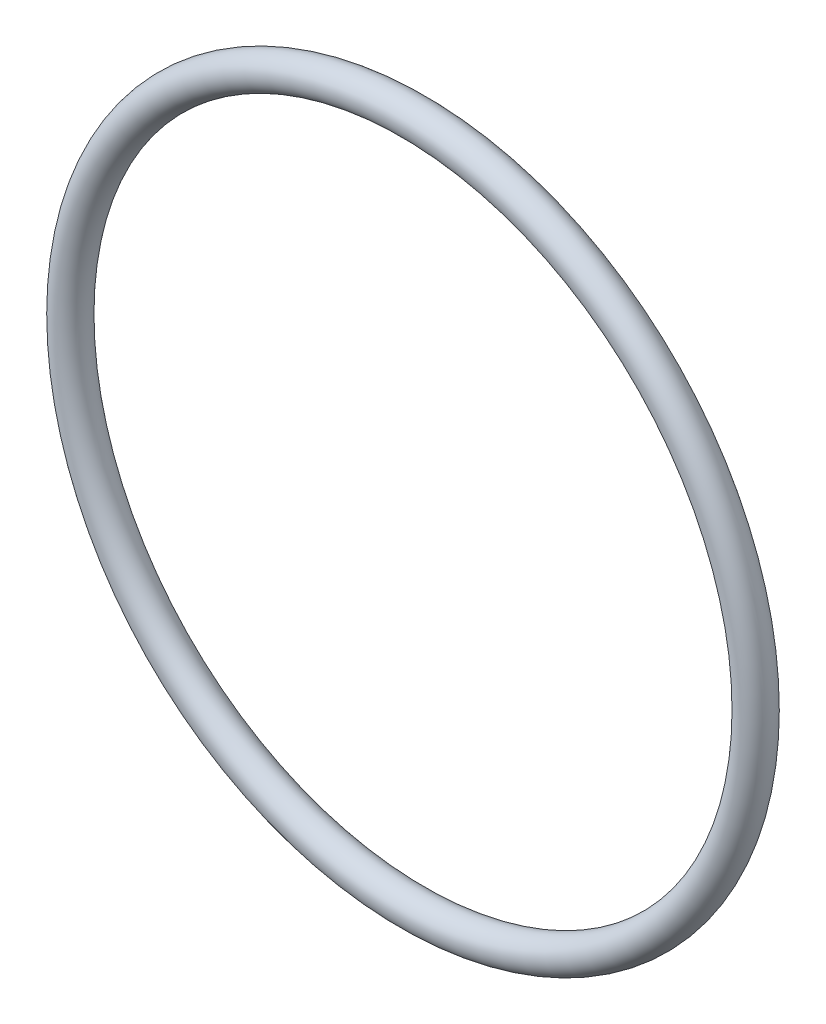
ISO-10303-21;
HEADER;
FILE_DESCRIPTION(('STEP AP214'),'2;1');
FILE_NAME('part.step','',(''),(''),'','','');
FILE_SCHEMA(('AUTOMOTIVE_DESIGN { 1 0 10303 214 1 1 1 1 }'));
ENDSEC;
DATA;
#1=APPLICATION_CONTEXT('core data for automotive mechanical design processes');
#2=APPLICATION_PROTOCOL_DEFINITION('international standard','automotive_design',2000,#1);
#3=PRODUCT_CONTEXT('',#1,'mechanical');
#4=PRODUCT('Part','Part','',(#3));
#5=PRODUCT_RELATED_PRODUCT_CATEGORY('part','',(#4));
#6=PRODUCT_DEFINITION_FORMATION('','',#4);
#7=PRODUCT_DEFINITION_CONTEXT('part definition',#1,'design');
#8=PRODUCT_DEFINITION('design','',#6,#7);
#9=PRODUCT_DEFINITION_SHAPE('','',#8);
#10=(LENGTH_UNIT() NAMED_UNIT(*) SI_UNIT(.MILLI.,.METRE.));
#11=(NAMED_UNIT(*) PLANE_ANGLE_UNIT() SI_UNIT($,.RADIAN.));
#12=(NAMED_UNIT(*) SI_UNIT($,.STERADIAN.) SOLID_ANGLE_UNIT());
#13=UNCERTAINTY_MEASURE_WITH_UNIT(LENGTH_MEASURE(1.E-05),#10,'distance_accuracy_value','');
#14=(GEOMETRIC_REPRESENTATION_CONTEXT(3) GLOBAL_UNCERTAINTY_ASSIGNED_CONTEXT((#13)) GLOBAL_UNIT_ASSIGNED_CONTEXT((#10,
#11,#12)) REPRESENTATION_CONTEXT('',''));
#15=CARTESIAN_POINT('',(0.,0.,0.));
#16=DIRECTION('',(0.,0.,1.));
#17=DIRECTION('',(1.,0.,0.));
#18=AXIS2_PLACEMENT_3D('',#15,#16,#17);
#19=CARTESIAN_POINT('',(0.,0.,0.));
#20=DIRECTION('',(0.,0.,1.));
#21=DIRECTION('',(1.,0.,0.));
#22=AXIS2_PLACEMENT_3D('',#19,#20,#21);
#23=TOROIDAL_SURFACE('',#22,18.2118,0.888999999999996);
#24=CARTESIAN_POINT('',(19.1008,0.,0.));
#25=VERTEX_POINT('',#24);
#26=VERTEX_LOOP('',#25);
#27=FACE_BOUND('',#26,.T.);
#28=ADVANCED_FACE('F38',(#27),#23,.T.);
#29=CLOSED_SHELL('',(#28));
#30=MANIFOLD_SOLID_BREP('B2',#29);
#31=ADVANCED_BREP_SHAPE_REPRESENTATION('',(#18,#30),#14);
#32=SHAPE_DEFINITION_REPRESENTATION(#9,#31);
ENDSEC;
END-ISO-10303-21;
